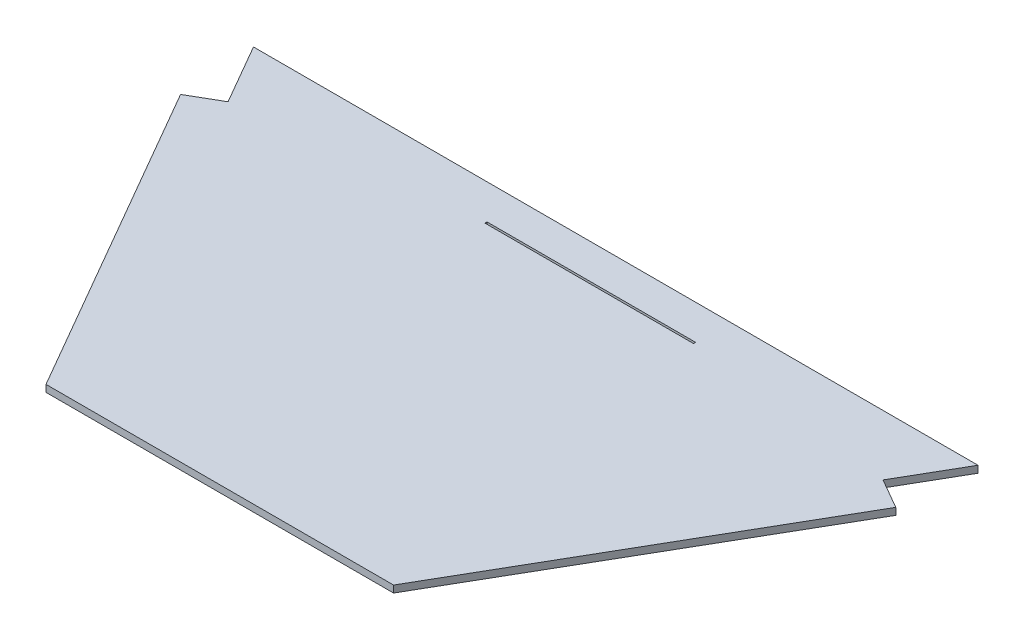
ISO-10303-21;
HEADER;
FILE_DESCRIPTION(('STEP AP214'),'2;1');
FILE_NAME('part.step','',(''),(''),'','','');
FILE_SCHEMA(('AUTOMOTIVE_DESIGN { 1 0 10303 214 1 1 1 1 }'));
ENDSEC;
DATA;
#1=APPLICATION_CONTEXT('core data for automotive mechanical design processes');
#2=APPLICATION_PROTOCOL_DEFINITION('international standard','automotive_design',2000,#1);
#3=PRODUCT_CONTEXT('',#1,'mechanical');
#4=PRODUCT('Part','Part','',(#3));
#5=PRODUCT_RELATED_PRODUCT_CATEGORY('part','',(#4));
#6=PRODUCT_DEFINITION_FORMATION('','',#4);
#7=PRODUCT_DEFINITION_CONTEXT('part definition',#1,'design');
#8=PRODUCT_DEFINITION('design','',#6,#7);
#9=PRODUCT_DEFINITION_SHAPE('','',#8);
#10=(LENGTH_UNIT() NAMED_UNIT(*) SI_UNIT(.MILLI.,.METRE.));
#11=(NAMED_UNIT(*) PLANE_ANGLE_UNIT() SI_UNIT($,.RADIAN.));
#12=(NAMED_UNIT(*) SI_UNIT($,.STERADIAN.) SOLID_ANGLE_UNIT());
#13=UNCERTAINTY_MEASURE_WITH_UNIT(LENGTH_MEASURE(1.E-05),#10,'distance_accuracy_value','');
#14=(GEOMETRIC_REPRESENTATION_CONTEXT(3) GLOBAL_UNCERTAINTY_ASSIGNED_CONTEXT((#13)) GLOBAL_UNIT_ASSIGNED_CONTEXT((#10,
#11,#12)) REPRESENTATION_CONTEXT('',''));
#15=CARTESIAN_POINT('',(0.,0.,0.));
#16=DIRECTION('',(0.,0.,1.));
#17=DIRECTION('',(1.,0.,0.));
#18=AXIS2_PLACEMENT_3D('',#15,#16,#17);
#19=CARTESIAN_POINT('',(0.,10.,0.));
#20=DIRECTION('',(0.86602540378444,0.,-0.499999999999998));
#21=DIRECTION('',(-0.499999999999998,0.,-0.86602540378444));
#22=AXIS2_PLACEMENT_3D('',#19,#20,#21);
#23=PLANE('',#22);
#24=DIRECTION('',(0.499999999999998,0.,0.86602540378444));
#25=VECTOR('',#24,1.);
#26=CARTESIAN_POINT('',(0.,0.,0.));
#27=LINE('',#26,#25);
#28=CARTESIAN_POINT('',(-264.434999999999,0.,-458.014855299477));
#29=VERTEX_POINT('',#28);
#30=CARTESIAN_POINT('',(0.,0.,0.));
#31=VERTEX_POINT('',#30);
#32=EDGE_CURVE('E157',#29,#31,#27,.T.);
#33=ORIENTED_EDGE('',*,*,#32,.T.);
#34=DIRECTION('',(0.,-1.,0.));
#35=VECTOR('',#34,1.);
#36=CARTESIAN_POINT('',(0.,10.,0.));
#37=LINE('',#36,#35);
#38=CARTESIAN_POINT('',(0.,10.,0.));
#39=VERTEX_POINT('',#38);
#40=EDGE_CURVE('E11',#39,#31,#37,.T.);
#41=ORIENTED_EDGE('',*,*,#40,.F.);
#42=DIRECTION('',(0.499999999999998,0.,0.86602540378444));
#43=VECTOR('',#42,1.);
#44=CARTESIAN_POINT('',(0.,10.,0.));
#45=LINE('',#44,#43);
#46=CARTESIAN_POINT('',(-264.434999999999,10.,-458.014855299477));
#47=VERTEX_POINT('',#46);
#48=EDGE_CURVE('E161',#47,#39,#45,.T.);
#49=ORIENTED_EDGE('',*,*,#48,.F.);
#50=DIRECTION('',(0.,-1.,0.));
#51=VECTOR('',#50,1.);
#52=CARTESIAN_POINT('',(-264.434999999999,10.,-458.014855299477));
#53=LINE('',#52,#51);
#54=EDGE_CURVE('E179',#47,#29,#53,.T.);
#55=ORIENTED_EDGE('',*,*,#54,.T.);
#56=EDGE_LOOP('',(#33,#41,#49,#55));
#57=FACE_BOUND('',#56,.T.);
#58=ADVANCED_FACE('F36',(#57),#23,.F.);
#59=CARTESIAN_POINT('',(500.,10.,0.));
#60=DIRECTION('',(0.,0.,-1.));
#61=DIRECTION('',(-1.,0.,0.));
#62=AXIS2_PLACEMENT_3D('',#59,#60,#61);
#63=PLANE('',#62);
#64=DIRECTION('',(1.,0.,0.));
#65=VECTOR('',#64,1.);
#66=CARTESIAN_POINT('',(500.,0.,0.));
#67=LINE('',#66,#65);
#68=CARTESIAN_POINT('',(500.,0.,0.));
#69=VERTEX_POINT('',#68);
#70=EDGE_CURVE('E182',#31,#69,#67,.T.);
#71=ORIENTED_EDGE('',*,*,#70,.T.);
#72=DIRECTION('',(0.,-1.,0.));
#73=VECTOR('',#72,1.);
#74=CARTESIAN_POINT('',(500.,10.,0.));
#75=LINE('',#74,#73);
#76=CARTESIAN_POINT('',(500.,10.,0.));
#77=VERTEX_POINT('',#76);
#78=EDGE_CURVE('E43',#77,#69,#75,.T.);
#79=ORIENTED_EDGE('',*,*,#78,.F.);
#80=DIRECTION('',(1.,0.,0.));
#81=VECTOR('',#80,1.);
#82=CARTESIAN_POINT('',(500.,10.,0.));
#83=LINE('',#82,#81);
#84=EDGE_CURVE('E164',#39,#77,#83,.T.);
#85=ORIENTED_EDGE('',*,*,#84,.F.);
#86=ORIENTED_EDGE('',*,*,#40,.T.);
#87=EDGE_LOOP('',(#71,#79,#85,#86));
#88=FACE_BOUND('',#87,.T.);
#89=ADVANCED_FACE('F237',(#88),#63,.F.);
#90=CARTESIAN_POINT('',(500.,10.,0.));
#91=DIRECTION('',(-0.866025403784437,0.,-0.500000000000004));
#92=DIRECTION('',(-0.500000000000004,0.,0.866025403784437));
#93=AXIS2_PLACEMENT_3D('',#90,#91,#92);
#94=PLANE('',#93);
#95=DIRECTION('',(0.500000000000004,0.,-0.866025403784436));
#96=VECTOR('',#95,1.);
#97=CARTESIAN_POINT('',(500.,0.,0.));
#98=LINE('',#97,#96);
#99=CARTESIAN_POINT('',(764.435000000002,0.,-458.014855299475));
#100=VERTEX_POINT('',#99);
#101=EDGE_CURVE('E184',#69,#100,#98,.T.);
#102=ORIENTED_EDGE('',*,*,#101,.T.);
#103=DIRECTION('',(0.,-1.,0.));
#104=VECTOR('',#103,1.);
#105=CARTESIAN_POINT('',(764.435000000002,10.,-458.014855299475));
#106=LINE('',#105,#104);
#107=CARTESIAN_POINT('',(764.435000000002,10.,-458.014855299475));
#108=VERTEX_POINT('',#107);
#109=EDGE_CURVE('E209',#108,#100,#106,.T.);
#110=ORIENTED_EDGE('',*,*,#109,.F.);
#111=DIRECTION('',(0.500000000000004,0.,-0.866025403784436));
#112=VECTOR('',#111,1.);
#113=CARTESIAN_POINT('',(500.,10.,0.));
#114=LINE('',#113,#112);
#115=EDGE_CURVE('E167',#77,#108,#114,.T.);
#116=ORIENTED_EDGE('',*,*,#115,.F.);
#117=ORIENTED_EDGE('',*,*,#78,.T.);
#118=EDGE_LOOP('',(#102,#110,#116,#117));
#119=FACE_BOUND('',#118,.T.);
#120=ADVANCED_FACE('F216',(#119),#94,.F.);
#121=CARTESIAN_POINT('',(764.435000000002,10.,-458.014855299475));
#122=DIRECTION('',(-0.500000000000006,0.,0.866025403784435));
#123=DIRECTION('',(0.866025403784435,0.,0.500000000000006));
#124=AXIS2_PLACEMENT_3D('',#121,#122,#123);
#125=PLANE('',#124);
#126=DIRECTION('',(-0.866025403784435,0.,-0.500000000000006));
#127=VECTOR('',#126,1.);
#128=CARTESIAN_POINT('',(764.435000000002,0.,-458.014855299475));
#129=LINE('',#128,#127);
#130=CARTESIAN_POINT('',(721.13372981078,0.,-483.014855299475));
#131=VERTEX_POINT('',#130);
#132=EDGE_CURVE('E186',#100,#131,#129,.T.);
#133=ORIENTED_EDGE('',*,*,#132,.T.);
#134=DIRECTION('',(0.,-1.,0.));
#135=VECTOR('',#134,1.);
#136=CARTESIAN_POINT('',(721.13372981078,10.,-483.014855299475));
#137=LINE('',#136,#135);
#138=CARTESIAN_POINT('',(721.13372981078,10.,-483.014855299475));
#139=VERTEX_POINT('',#138);
#140=EDGE_CURVE('E206',#139,#131,#137,.T.);
#141=ORIENTED_EDGE('',*,*,#140,.F.);
#142=DIRECTION('',(-0.866025403784435,0.,-0.500000000000006));
#143=VECTOR('',#142,1.);
#144=CARTESIAN_POINT('',(764.435000000002,10.,-458.014855299475));
#145=LINE('',#144,#143);
#146=EDGE_CURVE('E169',#108,#139,#145,.T.);
#147=ORIENTED_EDGE('',*,*,#146,.F.);
#148=ORIENTED_EDGE('',*,*,#109,.T.);
#149=EDGE_LOOP('',(#133,#141,#147,#148));
#150=FACE_BOUND('',#149,.T.);
#151=ADVANCED_FACE('F227',(#150),#125,.F.);
#152=CARTESIAN_POINT('',(721.13372981078,10.,-483.014855299475));
#153=DIRECTION('',(-0.866025403784437,0.,-0.500000000000003));
#154=DIRECTION('',(-0.500000000000003,0.,0.866025403784437));
#155=AXIS2_PLACEMENT_3D('',#152,#153,#154);
#156=PLANE('',#155);
#157=DIRECTION('',(0.500000000000003,0.,-0.866025403784437));
#158=VECTOR('',#157,1.);
#159=CARTESIAN_POINT('',(721.13372981078,0.,-483.014855299475));
#160=LINE('',#159,#158);
#161=CARTESIAN_POINT('',(771.13372981078,0.,-569.617395677919));
#162=VERTEX_POINT('',#161);
#163=EDGE_CURVE('E188',#131,#162,#160,.T.);
#164=ORIENTED_EDGE('',*,*,#163,.T.);
#165=DIRECTION('',(0.,-1.,0.));
#166=VECTOR('',#165,1.);
#167=CARTESIAN_POINT('',(771.13372981078,10.,-569.617395677919));
#168=LINE('',#167,#166);
#169=CARTESIAN_POINT('',(771.13372981078,10.,-569.617395677919));
#170=VERTEX_POINT('',#169);
#171=EDGE_CURVE('E203',#170,#162,#168,.T.);
#172=ORIENTED_EDGE('',*,*,#171,.F.);
#173=DIRECTION('',(0.500000000000003,0.,-0.866025403784437));
#174=VECTOR('',#173,1.);
#175=CARTESIAN_POINT('',(721.13372981078,10.,-483.014855299475));
#176=LINE('',#175,#174);
#177=EDGE_CURVE('E171',#139,#170,#176,.T.);
#178=ORIENTED_EDGE('',*,*,#177,.F.);
#179=ORIENTED_EDGE('',*,*,#140,.T.);
#180=EDGE_LOOP('',(#164,#172,#178,#179));
#181=FACE_BOUND('',#180,.T.);
#182=ADVANCED_FACE('F231',(#181),#156,.F.);
#183=CARTESIAN_POINT('',(-271.133729810777,10.,-569.617395677921));
#184=DIRECTION('',(0.,0.,1.));
#185=DIRECTION('',(1.,0.,0.));
#186=AXIS2_PLACEMENT_3D('',#183,#184,#185);
#187=PLANE('',#186);
#188=DIRECTION('',(-1.,0.,0.));
#189=VECTOR('',#188,1.);
#190=CARTESIAN_POINT('',(-271.133729810777,0.,-569.617395677921));
#191=LINE('',#190,#189);
#192=CARTESIAN_POINT('',(-271.133729810777,0.,-569.617395677921));
#193=VERTEX_POINT('',#192);
#194=EDGE_CURVE('E190',#162,#193,#191,.T.);
#195=ORIENTED_EDGE('',*,*,#194,.T.);
#196=DIRECTION('',(0.,-1.,0.));
#197=VECTOR('',#196,1.);
#198=CARTESIAN_POINT('',(-271.133729810777,10.,-569.617395677921));
#199=LINE('',#198,#197);
#200=CARTESIAN_POINT('',(-271.133729810777,10.,-569.617395677921));
#201=VERTEX_POINT('',#200);
#202=EDGE_CURVE('E200',#201,#193,#199,.T.);
#203=ORIENTED_EDGE('',*,*,#202,.F.);
#204=DIRECTION('',(-1.,0.,0.));
#205=VECTOR('',#204,1.);
#206=CARTESIAN_POINT('',(-271.133729810777,10.,-569.617395677921));
#207=LINE('',#206,#205);
#208=EDGE_CURVE('E173',#170,#201,#207,.T.);
#209=ORIENTED_EDGE('',*,*,#208,.F.);
#210=ORIENTED_EDGE('',*,*,#171,.T.);
#211=EDGE_LOOP('',(#195,#203,#209,#210));
#212=FACE_BOUND('',#211,.T.);
#213=ADVANCED_FACE('F250',(#212),#187,.F.);
#214=CARTESIAN_POINT('',(-221.133729810777,10.,-483.014855299476));
#215=DIRECTION('',(0.86602540378444,0.,-0.499999999999998));
#216=DIRECTION('',(-0.499999999999998,0.,-0.86602540378444));
#217=AXIS2_PLACEMENT_3D('',#214,#215,#216);
#218=PLANE('',#217);
#219=DIRECTION('',(0.499999999999998,0.,0.86602540378444));
#220=VECTOR('',#219,1.);
#221=CARTESIAN_POINT('',(-221.133729810777,0.,-483.014855299476));
#222=LINE('',#221,#220);
#223=CARTESIAN_POINT('',(-221.133729810777,0.,-483.014855299476));
#224=VERTEX_POINT('',#223);
#225=EDGE_CURVE('E192',#193,#224,#222,.T.);
#226=ORIENTED_EDGE('',*,*,#225,.T.);
#227=DIRECTION('',(0.,-1.,0.));
#228=VECTOR('',#227,1.);
#229=CARTESIAN_POINT('',(-221.133729810777,10.,-483.014855299476));
#230=LINE('',#229,#228);
#231=CARTESIAN_POINT('',(-221.133729810777,10.,-483.014855299476));
#232=VERTEX_POINT('',#231);
#233=EDGE_CURVE('E197',#232,#224,#230,.T.);
#234=ORIENTED_EDGE('',*,*,#233,.F.);
#235=DIRECTION('',(0.499999999999998,0.,0.86602540378444));
#236=VECTOR('',#235,1.);
#237=CARTESIAN_POINT('',(-221.133729810777,10.,-483.014855299476));
#238=LINE('',#237,#236);
#239=EDGE_CURVE('E175',#201,#232,#238,.T.);
#240=ORIENTED_EDGE('',*,*,#239,.F.);
#241=ORIENTED_EDGE('',*,*,#202,.T.);
#242=EDGE_LOOP('',(#226,#234,#240,#241));
#243=FACE_BOUND('',#242,.T.);
#244=ADVANCED_FACE('F248',(#243),#218,.F.);
#245=CARTESIAN_POINT('',(-264.434999999999,10.,-458.014855299477));
#246=DIRECTION('',(0.499999999999998,0.,0.86602540378444));
#247=DIRECTION('',(0.86602540378444,0.,-0.499999999999998));
#248=AXIS2_PLACEMENT_3D('',#245,#246,#247);
#249=PLANE('',#248);
#250=DIRECTION('',(-0.86602540378444,0.,0.499999999999998));
#251=VECTOR('',#250,1.);
#252=CARTESIAN_POINT('',(-264.434999999999,0.,-458.014855299477));
#253=LINE('',#252,#251);
#254=EDGE_CURVE('E165',#224,#29,#253,.T.);
#255=ORIENTED_EDGE('',*,*,#254,.T.);
#256=ORIENTED_EDGE('',*,*,#54,.F.);
#257=DIRECTION('',(-0.86602540378444,0.,0.499999999999998));
#258=VECTOR('',#257,1.);
#259=CARTESIAN_POINT('',(-264.434999999999,10.,-458.014855299477));
#260=LINE('',#259,#258);
#261=EDGE_CURVE('E177',#232,#47,#260,.T.);
#262=ORIENTED_EDGE('',*,*,#261,.F.);
#263=ORIENTED_EDGE('',*,*,#233,.T.);
#264=EDGE_LOOP('',(#255,#256,#262,#263));
#265=FACE_BOUND('',#264,.T.);
#266=ADVANCED_FACE('F243',(#265),#249,.F.);
#267=CARTESIAN_POINT('',(0.,10.,0.));
#268=DIRECTION('',(0.,-1.,0.));
#269=DIRECTION('',(0.,0.,-1.));
#270=AXIS2_PLACEMENT_3D('',#267,#268,#269);
#271=PLANE('',#270);
#272=DIRECTION('',(1.,0.,0.));
#273=VECTOR('',#272,1.);
#274=CARTESIAN_POINT('',(414.88,10.,-519.62));
#275=LINE('',#274,#273);
#276=CARTESIAN_POINT('',(114.88,10.,-519.62));
#277=VERTEX_POINT('',#276);
#278=CARTESIAN_POINT('',(414.88,10.,-519.62));
#279=VERTEX_POINT('',#278);
#280=EDGE_CURVE('E132',#277,#279,#275,.T.);
#281=ORIENTED_EDGE('',*,*,#280,.T.);
#282=DIRECTION('',(0.,0.,1.));
#283=VECTOR('',#282,1.);
#284=CARTESIAN_POINT('',(414.88,10.,-516.62));
#285=LINE('',#284,#283);
#286=CARTESIAN_POINT('',(414.88,10.,-516.62));
#287=VERTEX_POINT('',#286);
#288=EDGE_CURVE('E126',#279,#287,#285,.T.);
#289=ORIENTED_EDGE('',*,*,#288,.T.);
#290=DIRECTION('',(-1.,0.,0.));
#291=VECTOR('',#290,1.);
#292=CARTESIAN_POINT('',(114.88,10.,-516.62));
#293=LINE('',#292,#291);
#294=CARTESIAN_POINT('',(114.88,10.,-516.62));
#295=VERTEX_POINT('',#294);
#296=EDGE_CURVE('E135',#287,#295,#293,.T.);
#297=ORIENTED_EDGE('',*,*,#296,.T.);
#298=DIRECTION('',(0.,0.,-1.));
#299=VECTOR('',#298,1.);
#300=CARTESIAN_POINT('',(114.88,10.,-519.62));
#301=LINE('',#300,#299);
#302=EDGE_CURVE('E50',#295,#277,#301,.T.);
#303=ORIENTED_EDGE('',*,*,#302,.T.);
#304=EDGE_LOOP('',(#281,#289,#297,#303));
#305=FACE_BOUND('',#304,.T.);
#306=ORIENTED_EDGE('',*,*,#48,.T.);
#307=ORIENTED_EDGE('',*,*,#84,.T.);
#308=ORIENTED_EDGE('',*,*,#115,.T.);
#309=ORIENTED_EDGE('',*,*,#146,.T.);
#310=ORIENTED_EDGE('',*,*,#177,.T.);
#311=ORIENTED_EDGE('',*,*,#208,.T.);
#312=ORIENTED_EDGE('',*,*,#239,.T.);
#313=ORIENTED_EDGE('',*,*,#261,.T.);
#314=EDGE_LOOP('',(#306,#307,#308,#309,#310,#311,#312,#313));
#315=FACE_BOUND('',#314,.T.);
#316=ADVANCED_FACE('F139',(#305,#315),#271,.F.);
#317=CARTESIAN_POINT('',(0.,0.,0.));
#318=DIRECTION('',(0.,-1.,0.));
#319=DIRECTION('',(0.,0.,-1.));
#320=AXIS2_PLACEMENT_3D('',#317,#318,#319);
#321=PLANE('',#320);
#322=DIRECTION('',(0.,0.,1.));
#323=VECTOR('',#322,1.);
#324=CARTESIAN_POINT('',(414.88,0.,-516.62));
#325=LINE('',#324,#323);
#326=CARTESIAN_POINT('',(414.88,0.,-519.62));
#327=VERTEX_POINT('',#326);
#328=CARTESIAN_POINT('',(414.88,0.,-516.62));
#329=VERTEX_POINT('',#328);
#330=EDGE_CURVE('E58',#327,#329,#325,.T.);
#331=ORIENTED_EDGE('',*,*,#330,.F.);
#332=DIRECTION('',(1.,0.,0.));
#333=VECTOR('',#332,1.);
#334=CARTESIAN_POINT('',(414.88,0.,-519.62));
#335=LINE('',#334,#333);
#336=CARTESIAN_POINT('',(114.88,0.,-519.62));
#337=VERTEX_POINT('',#336);
#338=EDGE_CURVE('E142',#337,#327,#335,.T.);
#339=ORIENTED_EDGE('',*,*,#338,.F.);
#340=DIRECTION('',(0.,0.,-1.));
#341=VECTOR('',#340,1.);
#342=CARTESIAN_POINT('',(114.88,0.,-519.62));
#343=LINE('',#342,#341);
#344=CARTESIAN_POINT('',(114.88,0.,-516.62));
#345=VERTEX_POINT('',#344);
#346=EDGE_CURVE('E145',#345,#337,#343,.T.);
#347=ORIENTED_EDGE('',*,*,#346,.F.);
#348=DIRECTION('',(-1.,0.,0.));
#349=VECTOR('',#348,1.);
#350=CARTESIAN_POINT('',(114.88,0.,-516.62));
#351=LINE('',#350,#349);
#352=EDGE_CURVE('E151',#329,#345,#351,.T.);
#353=ORIENTED_EDGE('',*,*,#352,.F.);
#354=EDGE_LOOP('',(#331,#339,#347,#353));
#355=FACE_BOUND('',#354,.T.);
#356=ORIENTED_EDGE('',*,*,#32,.F.);
#357=ORIENTED_EDGE('',*,*,#254,.F.);
#358=ORIENTED_EDGE('',*,*,#225,.F.);
#359=ORIENTED_EDGE('',*,*,#194,.F.);
#360=ORIENTED_EDGE('',*,*,#163,.F.);
#361=ORIENTED_EDGE('',*,*,#132,.F.);
#362=ORIENTED_EDGE('',*,*,#101,.F.);
#363=ORIENTED_EDGE('',*,*,#70,.F.);
#364=EDGE_LOOP('',(#356,#357,#358,#359,#360,#361,#362,#363));
#365=FACE_BOUND('',#364,.T.);
#366=ADVANCED_FACE('F222',(#355,#365),#321,.T.);
#367=CARTESIAN_POINT('',(414.88,10.,-516.62));
#368=DIRECTION('',(1.,0.,0.));
#369=DIRECTION('',(0.,0.,-1.));
#370=AXIS2_PLACEMENT_3D('',#367,#368,#369);
#371=PLANE('',#370);
#372=ORIENTED_EDGE('',*,*,#330,.T.);
#373=DIRECTION('',(0.,-1.,0.));
#374=VECTOR('',#373,1.);
#375=CARTESIAN_POINT('',(414.88,10.,-516.62));
#376=LINE('',#375,#374);
#377=EDGE_CURVE('E122',#287,#329,#376,.T.);
#378=ORIENTED_EDGE('',*,*,#377,.F.);
#379=ORIENTED_EDGE('',*,*,#288,.F.);
#380=DIRECTION('',(0.,-1.,0.));
#381=VECTOR('',#380,1.);
#382=CARTESIAN_POINT('',(414.88,10.,-519.62));
#383=LINE('',#382,#381);
#384=EDGE_CURVE('E155',#279,#327,#383,.T.);
#385=ORIENTED_EDGE('',*,*,#384,.T.);
#386=EDGE_LOOP('',(#372,#378,#379,#385));
#387=FACE_BOUND('',#386,.T.);
#388=ADVANCED_FACE('F124',(#387),#371,.F.);
#389=CARTESIAN_POINT('',(414.88,10.,-519.62));
#390=DIRECTION('',(0.,0.,-1.));
#391=DIRECTION('',(-1.,0.,0.));
#392=AXIS2_PLACEMENT_3D('',#389,#390,#391);
#393=PLANE('',#392);
#394=ORIENTED_EDGE('',*,*,#338,.T.);
#395=ORIENTED_EDGE('',*,*,#384,.F.);
#396=ORIENTED_EDGE('',*,*,#280,.F.);
#397=DIRECTION('',(0.,-1.,0.));
#398=VECTOR('',#397,1.);
#399=CARTESIAN_POINT('',(114.88,10.,-519.62));
#400=LINE('',#399,#398);
#401=EDGE_CURVE('E158',#277,#337,#400,.T.);
#402=ORIENTED_EDGE('',*,*,#401,.T.);
#403=EDGE_LOOP('',(#394,#395,#396,#402));
#404=FACE_BOUND('',#403,.T.);
#405=ADVANCED_FACE('F321',(#404),#393,.F.);
#406=CARTESIAN_POINT('',(114.88,10.,-519.62));
#407=DIRECTION('',(-1.,0.,0.));
#408=DIRECTION('',(0.,0.,1.));
#409=AXIS2_PLACEMENT_3D('',#406,#407,#408);
#410=PLANE('',#409);
#411=ORIENTED_EDGE('',*,*,#346,.T.);
#412=ORIENTED_EDGE('',*,*,#401,.F.);
#413=ORIENTED_EDGE('',*,*,#302,.F.);
#414=DIRECTION('',(0.,-1.,0.));
#415=VECTOR('',#414,1.);
#416=CARTESIAN_POINT('',(114.88,10.,-516.62));
#417=LINE('',#416,#415);
#418=EDGE_CURVE('E131',#295,#345,#417,.T.);
#419=ORIENTED_EDGE('',*,*,#418,.T.);
#420=EDGE_LOOP('',(#411,#412,#413,#419));
#421=FACE_BOUND('',#420,.T.);
#422=ADVANCED_FACE('F330',(#421),#410,.F.);
#423=CARTESIAN_POINT('',(114.88,10.,-516.62));
#424=DIRECTION('',(0.,0.,1.));
#425=DIRECTION('',(1.,0.,0.));
#426=AXIS2_PLACEMENT_3D('',#423,#424,#425);
#427=PLANE('',#426);
#428=ORIENTED_EDGE('',*,*,#352,.T.);
#429=ORIENTED_EDGE('',*,*,#418,.F.);
#430=ORIENTED_EDGE('',*,*,#296,.F.);
#431=ORIENTED_EDGE('',*,*,#377,.T.);
#432=EDGE_LOOP('',(#428,#429,#430,#431));
#433=FACE_BOUND('',#432,.T.);
#434=ADVANCED_FACE('F136',(#433),#427,.F.);
#435=CLOSED_SHELL('',(#58,#89,#120,#151,#182,#213,#244,#266,#316,#366,#388,#405,#422,#434));
#436=MANIFOLD_SOLID_BREP('B2',#435);
#437=ADVANCED_BREP_SHAPE_REPRESENTATION('',(#18,#436),#14);
#438=SHAPE_DEFINITION_REPRESENTATION(#9,#437);
ENDSEC;
END-ISO-10303-21;
